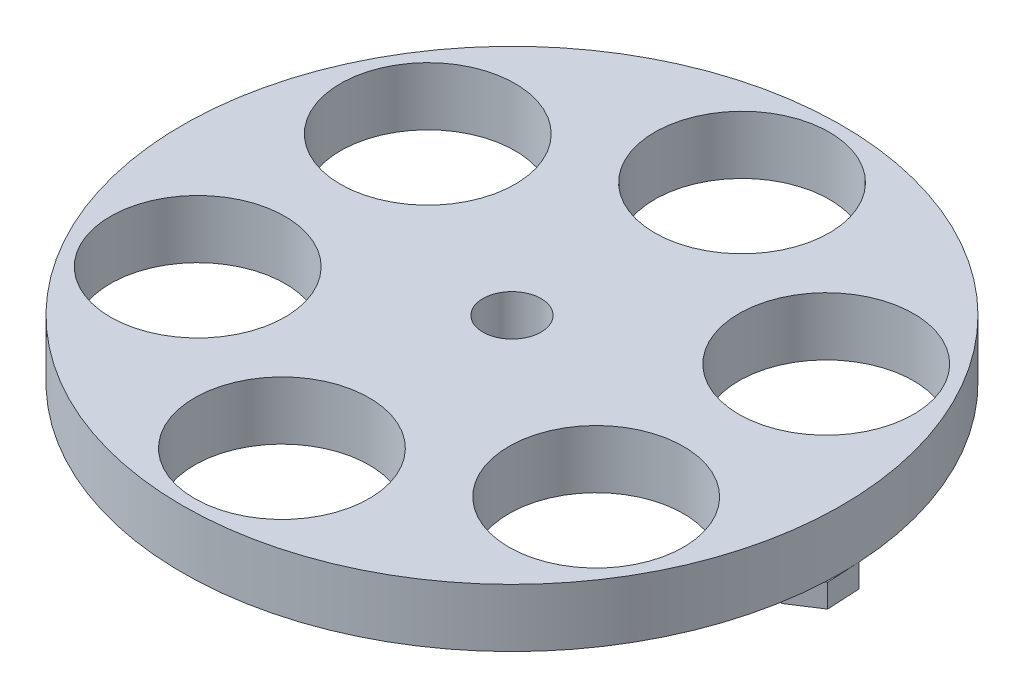
ISO-10303-21;
HEADER;
FILE_DESCRIPTION(('STEP AP214'),'2;1');
FILE_NAME('part.step','',(''),(''),'','','');
FILE_SCHEMA(('AUTOMOTIVE_DESIGN { 1 0 10303 214 1 1 1 1 }'));
ENDSEC;
DATA;
#1=APPLICATION_CONTEXT('core data for automotive mechanical design processes');
#2=APPLICATION_PROTOCOL_DEFINITION('international standard','automotive_design',2000,#1);
#3=PRODUCT_CONTEXT('',#1,'mechanical');
#4=PRODUCT('Part','Part','',(#3));
#5=PRODUCT_RELATED_PRODUCT_CATEGORY('part','',(#4));
#6=PRODUCT_DEFINITION_FORMATION('','',#4);
#7=PRODUCT_DEFINITION_CONTEXT('part definition',#1,'design');
#8=PRODUCT_DEFINITION('design','',#6,#7);
#9=PRODUCT_DEFINITION_SHAPE('','',#8);
#10=(LENGTH_UNIT() NAMED_UNIT(*) SI_UNIT(.MILLI.,.METRE.));
#11=(NAMED_UNIT(*) PLANE_ANGLE_UNIT() SI_UNIT($,.RADIAN.));
#12=(NAMED_UNIT(*) SI_UNIT($,.STERADIAN.) SOLID_ANGLE_UNIT());
#13=UNCERTAINTY_MEASURE_WITH_UNIT(LENGTH_MEASURE(1.E-05),#10,'distance_accuracy_value','');
#14=(GEOMETRIC_REPRESENTATION_CONTEXT(3) GLOBAL_UNCERTAINTY_ASSIGNED_CONTEXT((#13)) GLOBAL_UNIT_ASSIGNED_CONTEXT((#10,
#11,#12)) REPRESENTATION_CONTEXT('',''));
#15=CARTESIAN_POINT('',(0.,0.,0.));
#16=DIRECTION('',(0.,0.,1.));
#17=DIRECTION('',(1.,0.,0.));
#18=AXIS2_PLACEMENT_3D('',#15,#16,#17);
#19=CARTESIAN_POINT('',(0.,0.,0.));
#20=DIRECTION('',(0.,1.,0.));
#21=DIRECTION('',(0.,0.,1.));
#22=AXIS2_PLACEMENT_3D('',#19,#20,#21);
#23=PLANE('',#22);
#24=CARTESIAN_POINT('',(-68.4595093108157,0.,-39.5251161291902));
#25=DIRECTION('',(0.,1.,0.));
#26=DIRECTION('',(0.,0.,1.));
#27=AXIS2_PLACEMENT_3D('',#24,#25,#26);
#28=CIRCLE('',#27,30.);
#29=CARTESIAN_POINT('',(-68.4595093108157,0.,-9.52511612919019));
#30=VERTEX_POINT('',#29);
#31=EDGE_CURVE('E133',#30,#30,#28,.T.);
#32=ORIENTED_EDGE('',*,*,#31,.T.);
#33=EDGE_LOOP('',(#32));
#34=FACE_BOUND('',#33,.T.);
#35=CARTESIAN_POINT('',(-68.4595093108165,0.,39.5251161291887));
#36=DIRECTION('',(0.,1.,0.));
#37=DIRECTION('',(0.,0.,1.));
#38=AXIS2_PLACEMENT_3D('',#35,#36,#37);
#39=CIRCLE('',#38,30.);
#40=CARTESIAN_POINT('',(-68.4595093108165,0.,69.5251161291887));
#41=VERTEX_POINT('',#40);
#42=EDGE_CURVE('E405',#41,#41,#39,.T.);
#43=ORIENTED_EDGE('',*,*,#42,.T.);
#44=EDGE_LOOP('',(#43));
#45=FACE_BOUND('',#44,.T.);
#46=CARTESIAN_POINT('',(-5.5200482152269E-13,0.,79.0502322583788));
#47=DIRECTION('',(0.,1.,0.));
#48=DIRECTION('',(0.,0.,1.));
#49=AXIS2_PLACEMENT_3D('',#46,#47,#48);
#50=CIRCLE('',#49,30.);
#51=CARTESIAN_POINT('',(-5.5200482152269E-13,0.,109.050232258379));
#52=VERTEX_POINT('',#51);
#53=EDGE_CURVE('E415',#52,#52,#50,.T.);
#54=ORIENTED_EDGE('',*,*,#53,.T.);
#55=EDGE_LOOP('',(#54));
#56=FACE_BOUND('',#55,.T.);
#57=CARTESIAN_POINT('',(68.459509310816,0.,39.5251161291897));
#58=DIRECTION('',(0.,1.,0.));
#59=DIRECTION('',(0.,0.,1.));
#60=AXIS2_PLACEMENT_3D('',#57,#58,#59);
#61=CIRCLE('',#60,30.);
#62=CARTESIAN_POINT('',(68.459509310816,0.,69.5251161291897));
#63=VERTEX_POINT('',#62);
#64=EDGE_CURVE('E419',#63,#63,#61,.T.);
#65=ORIENTED_EDGE('',*,*,#64,.T.);
#66=EDGE_LOOP('',(#65));
#67=FACE_BOUND('',#66,.T.);
#68=CARTESIAN_POINT('',(68.4595093108162,0.,-39.5251161291892));
#69=DIRECTION('',(0.,1.,0.));
#70=DIRECTION('',(0.,0.,1.));
#71=AXIS2_PLACEMENT_3D('',#68,#69,#70);
#72=CIRCLE('',#71,30.);
#73=CARTESIAN_POINT('',(68.4595093108162,0.,-9.52511612918922));
#74=VERTEX_POINT('',#73);
#75=EDGE_CURVE('E427',#74,#74,#72,.T.);
#76=ORIENTED_EDGE('',*,*,#75,.T.);
#77=EDGE_LOOP('',(#76));
#78=FACE_BOUND('',#77,.T.);
#79=CARTESIAN_POINT('',(0.,0.,0.));
#80=DIRECTION('',(0.,1.,0.));
#81=DIRECTION('',(0.,0.,1.));
#82=AXIS2_PLACEMENT_3D('',#79,#80,#81);
#83=CIRCLE('',#82,10.);
#84=CARTESIAN_POINT('',(0.,0.,10.));
#85=VERTEX_POINT('',#84);
#86=EDGE_CURVE('E283',#85,#85,#83,.T.);
#87=ORIENTED_EDGE('',*,*,#86,.T.);
#88=EDGE_LOOP('',(#87));
#89=FACE_BOUND('',#88,.T.);
#90=CARTESIAN_POINT('',(0.,0.,-79.0502322583788));
#91=DIRECTION('',(0.,1.,0.));
#92=DIRECTION('',(0.,0.,1.));
#93=AXIS2_PLACEMENT_3D('',#90,#91,#92);
#94=CIRCLE('',#93,30.);
#95=CARTESIAN_POINT('',(0.,0.,-49.0502322583788));
#96=VERTEX_POINT('',#95);
#97=EDGE_CURVE('E275',#96,#96,#94,.T.);
#98=ORIENTED_EDGE('',*,*,#97,.T.);
#99=EDGE_LOOP('',(#98));
#100=FACE_BOUND('',#99,.T.);
#101=DIRECTION('',(-0.838864437276425,0.,0.544340386038835));
#102=VECTOR('',#101,1.);
#103=CARTESIAN_POINT('',(113.651716101007,0.,5.19766672348683));
#104=LINE('',#103,#102);
#105=CARTESIAN_POINT('',(113.091770209168,0.,5.56101644887739));
#106=VERTEX_POINT('',#105);
#107=CARTESIAN_POINT('',(104.054393451037,0.,11.4253837228936));
#108=VERTEX_POINT('',#107);
#109=EDGE_CURVE('E11',#106,#108,#104,.T.);
#110=ORIENTED_EDGE('',*,*,#109,.F.);
#111=CARTESIAN_POINT('',(0.,0.,0.));
#112=DIRECTION('',(0.,1.,0.));
#113=DIRECTION('',(0.,0.,1.));
#114=AXIS2_PLACEMENT_3D('',#111,#112,#113);
#115=CIRCLE('',#114,113.228412481091);
#116=CARTESIAN_POINT('',(113.057016296927,0.,-6.22771699939129));
#117=VERTEX_POINT('',#116);
#118=EDGE_CURVE('E186',#117,#106,#115,.T.);
#119=ORIENTED_EDGE('',*,*,#118,.F.);
#120=DIRECTION('',(0.89084482125367,0.,0.454307719993306));
#121=VECTOR('',#120,1.);
#122=CARTESIAN_POINT('',(102.864993842874,0.,-11.4253837228936));
#123=LINE('',#122,#121);
#124=CARTESIAN_POINT('',(102.864993842874,0.,-11.4253837228936));
#125=VERTEX_POINT('',#124);
#126=EDGE_CURVE('E66',#125,#117,#123,.T.);
#127=ORIENTED_EDGE('',*,*,#126,.F.);
#128=DIRECTION('',(0.838864437276425,0.,-0.544340386038833));
#129=VECTOR('',#128,1.);
#130=CARTESIAN_POINT('',(93.2676711929036,0.,-5.19766672348685));
#131=LINE('',#130,#129);
#132=CARTESIAN_POINT('',(93.2676711929036,0.,-5.19766672348685));
#133=VERTEX_POINT('',#132);
#134=EDGE_CURVE('E129',#133,#125,#131,.T.);
#135=ORIENTED_EDGE('',*,*,#134,.F.);
#136=DIRECTION('',(-0.0519803839772457,0.,-0.998648106032139));
#137=VECTOR('',#136,1.);
#138=CARTESIAN_POINT('',(93.8623709969848,0.,6.22771699940675));
#139=LINE('',#138,#137);
#140=CARTESIAN_POINT('',(93.8623709969848,0.,6.22771699940675));
#141=VERTEX_POINT('',#140);
#142=EDGE_CURVE('E164',#141,#133,#139,.T.);
#143=ORIENTED_EDGE('',*,*,#142,.F.);
#144=DIRECTION('',(-0.890844821253671,0.,-0.454307719993304));
#145=VECTOR('',#144,1.);
#146=CARTESIAN_POINT('',(104.054393451037,0.,11.4253837228936));
#147=LINE('',#146,#145);
#148=EDGE_CURVE('E160',#108,#141,#147,.T.);
#149=ORIENTED_EDGE('',*,*,#148,.F.);
#150=EDGE_LOOP('',(#110,#119,#127,#135,#143,#149));
#151=FACE_BOUND('',#150,.T.);
#152=ADVANCED_FACE('F45',(#34,#45,#56,#67,#78,#89,#100,#151),#23,.F.);
#153=CARTESIAN_POINT('',(0.,20.,0.));
#154=DIRECTION('',(0.,1.,0.));
#155=DIRECTION('',(0.,0.,1.));
#156=AXIS2_PLACEMENT_3D('',#153,#154,#155);
#157=PLANE('',#156);
#158=CARTESIAN_POINT('',(-68.4595093108165,20.,39.5251161291887));
#159=DIRECTION('',(0.,1.,0.));
#160=DIRECTION('',(0.,0.,1.));
#161=AXIS2_PLACEMENT_3D('',#158,#159,#160);
#162=CIRCLE('',#161,30.);
#163=CARTESIAN_POINT('',(-68.4595093108165,20.,69.5251161291887));
#164=VERTEX_POINT('',#163);
#165=EDGE_CURVE('E409',#164,#164,#162,.T.);
#166=ORIENTED_EDGE('',*,*,#165,.F.);
#167=EDGE_LOOP('',(#166));
#168=FACE_BOUND('',#167,.T.);
#169=CARTESIAN_POINT('',(68.459509310816,20.,39.5251161291897));
#170=DIRECTION('',(0.,1.,0.));
#171=DIRECTION('',(0.,0.,1.));
#172=AXIS2_PLACEMENT_3D('',#169,#170,#171);
#173=CIRCLE('',#172,30.);
#174=CARTESIAN_POINT('',(68.459509310816,20.,69.5251161291897));
#175=VERTEX_POINT('',#174);
#176=EDGE_CURVE('E423',#175,#175,#173,.T.);
#177=ORIENTED_EDGE('',*,*,#176,.F.);
#178=EDGE_LOOP('',(#177));
#179=FACE_BOUND('',#178,.T.);
#180=CARTESIAN_POINT('',(0.,20.,0.));
#181=DIRECTION('',(0.,1.,0.));
#182=DIRECTION('',(0.,0.,1.));
#183=AXIS2_PLACEMENT_3D('',#180,#181,#182);
#184=CIRCLE('',#183,10.);
#185=CARTESIAN_POINT('',(0.,20.,10.));
#186=VERTEX_POINT('',#185);
#187=EDGE_CURVE('E280',#186,#186,#184,.T.);
#188=ORIENTED_EDGE('',*,*,#187,.F.);
#189=EDGE_LOOP('',(#188));
#190=FACE_BOUND('',#189,.T.);
#191=CARTESIAN_POINT('',(0.,20.,0.));
#192=DIRECTION('',(0.,1.,0.));
#193=DIRECTION('',(0.,0.,1.));
#194=AXIS2_PLACEMENT_3D('',#191,#192,#193);
#195=CIRCLE('',#194,113.228412481091);
#196=CARTESIAN_POINT('',(0.,20.,113.228412481091));
#197=VERTEX_POINT('',#196);
#198=EDGE_CURVE('E57',#197,#197,#195,.T.);
#199=ORIENTED_EDGE('',*,*,#198,.T.);
#200=EDGE_LOOP('',(#199));
#201=FACE_BOUND('',#200,.T.);
#202=CARTESIAN_POINT('',(0.,20.,-79.0502322583788));
#203=DIRECTION('',(0.,1.,0.));
#204=DIRECTION('',(0.,0.,1.));
#205=AXIS2_PLACEMENT_3D('',#202,#203,#204);
#206=CIRCLE('',#205,30.);
#207=CARTESIAN_POINT('',(0.,20.,-49.0502322583788));
#208=VERTEX_POINT('',#207);
#209=EDGE_CURVE('E272',#208,#208,#206,.T.);
#210=ORIENTED_EDGE('',*,*,#209,.F.);
#211=EDGE_LOOP('',(#210));
#212=FACE_BOUND('',#211,.T.);
#213=CARTESIAN_POINT('',(68.4595093108162,20.,-39.5251161291892));
#214=DIRECTION('',(0.,1.,0.));
#215=DIRECTION('',(0.,0.,1.));
#216=AXIS2_PLACEMENT_3D('',#213,#214,#215);
#217=CIRCLE('',#216,30.);
#218=CARTESIAN_POINT('',(68.4595093108162,20.,-9.52511612918922));
#219=VERTEX_POINT('',#218);
#220=EDGE_CURVE('E397',#219,#219,#217,.T.);
#221=ORIENTED_EDGE('',*,*,#220,.F.);
#222=EDGE_LOOP('',(#221));
#223=FACE_BOUND('',#222,.T.);
#224=CARTESIAN_POINT('',(-5.5200482152269E-13,20.,79.0502322583788));
#225=DIRECTION('',(0.,1.,0.));
#226=DIRECTION('',(0.,0.,1.));
#227=AXIS2_PLACEMENT_3D('',#224,#225,#226);
#228=CIRCLE('',#227,30.);
#229=CARTESIAN_POINT('',(-5.5200482152269E-13,20.,109.050232258379));
#230=VERTEX_POINT('',#229);
#231=EDGE_CURVE('E401',#230,#230,#228,.T.);
#232=ORIENTED_EDGE('',*,*,#231,.F.);
#233=EDGE_LOOP('',(#232));
#234=FACE_BOUND('',#233,.T.);
#235=CARTESIAN_POINT('',(-68.4595093108157,20.,-39.5251161291902));
#236=DIRECTION('',(0.,1.,0.));
#237=DIRECTION('',(0.,0.,1.));
#238=AXIS2_PLACEMENT_3D('',#235,#236,#237);
#239=CIRCLE('',#238,30.);
#240=CARTESIAN_POINT('',(-68.4595093108157,20.,-9.52511612919019));
#241=VERTEX_POINT('',#240);
#242=EDGE_CURVE('E138',#241,#241,#239,.T.);
#243=ORIENTED_EDGE('',*,*,#242,.F.);
#244=EDGE_LOOP('',(#243));
#245=FACE_BOUND('',#244,.T.);
#246=ADVANCED_FACE('F211',(#168,#179,#190,#201,#212,#223,#234,#245),#157,.T.);
#247=CARTESIAN_POINT('',(0.,20.,0.));
#248=DIRECTION('',(0.,-1.,0.));
#249=DIRECTION('',(0.,0.,-1.));
#250=AXIS2_PLACEMENT_3D('',#247,#248,#249);
#251=CYLINDRICAL_SURFACE('',#250,113.228412481091);
#252=ORIENTED_EDGE('',*,*,#198,.F.);
#253=EDGE_LOOP('',(#252));
#254=FACE_BOUND('',#253,.T.);
#255=CARTESIAN_POINT('',(113.092628127426,0.,-5.54354184793427));
#256=VERTEX_POINT('',#255);
#257=EDGE_CURVE('E189',#106,#256,#115,.T.);
#258=ORIENTED_EDGE('',*,*,#257,.T.);
#259=CARTESIAN_POINT('',(113.057016296926,0.,-6.22771699940676));
#260=DIRECTION('',(0.0519803839772377,0.,0.998648106032139));
#261=VECTOR('',#260,1.);
#262=LINE('',#259,#261);
#263=EDGE_CURVE('E161',#117,#256,#262,.T.);
#264=ORIENTED_EDGE('',*,*,#263,.F.);
#265=ORIENTED_EDGE('',*,*,#118,.T.);
#266=EDGE_LOOP('',(#258,#264,#265));
#267=FACE_BOUND('',#266,.T.);
#268=ADVANCED_FACE('F47',(#254,#267),#251,.T.);
#269=CARTESIAN_POINT('',(0.,20.,-79.0502322583788));
#270=DIRECTION('',(0.,-1.,0.));
#271=DIRECTION('',(0.,0.,-1.));
#272=AXIS2_PLACEMENT_3D('',#269,#270,#271);
#273=CYLINDRICAL_SURFACE('',#272,30.);
#274=ORIENTED_EDGE('',*,*,#209,.T.);
#275=EDGE_LOOP('',(#274));
#276=FACE_BOUND('',#275,.T.);
#277=ORIENTED_EDGE('',*,*,#97,.F.);
#278=EDGE_LOOP('',(#277));
#279=FACE_BOUND('',#278,.T.);
#280=ADVANCED_FACE('F222',(#276,#279),#273,.F.);
#281=CARTESIAN_POINT('',(0.,20.,0.));
#282=DIRECTION('',(0.,-1.,0.));
#283=DIRECTION('',(0.,0.,-1.));
#284=AXIS2_PLACEMENT_3D('',#281,#282,#283);
#285=CYLINDRICAL_SURFACE('',#284,10.);
#286=ORIENTED_EDGE('',*,*,#187,.T.);
#287=EDGE_LOOP('',(#286));
#288=FACE_BOUND('',#287,.T.);
#289=ORIENTED_EDGE('',*,*,#86,.F.);
#290=EDGE_LOOP('',(#289));
#291=FACE_BOUND('',#290,.T.);
#292=ADVANCED_FACE('F225',(#288,#291),#285,.F.);
#293=CARTESIAN_POINT('',(68.4595093108162,20.,-39.5251161291892));
#294=DIRECTION('',(0.,-1.,0.));
#295=DIRECTION('',(0.,0.,-1.));
#296=AXIS2_PLACEMENT_3D('',#293,#294,#295);
#297=CYLINDRICAL_SURFACE('',#296,30.);
#298=ORIENTED_EDGE('',*,*,#220,.T.);
#299=EDGE_LOOP('',(#298));
#300=FACE_BOUND('',#299,.T.);
#301=ORIENTED_EDGE('',*,*,#75,.F.);
#302=EDGE_LOOP('',(#301));
#303=FACE_BOUND('',#302,.T.);
#304=ADVANCED_FACE('F229',(#300,#303),#297,.F.);
#305=CARTESIAN_POINT('',(68.459509310816,20.,39.5251161291897));
#306=DIRECTION('',(0.,-1.,0.));
#307=DIRECTION('',(0.,0.,-1.));
#308=AXIS2_PLACEMENT_3D('',#305,#306,#307);
#309=CYLINDRICAL_SURFACE('',#308,30.);
#310=ORIENTED_EDGE('',*,*,#176,.T.);
#311=EDGE_LOOP('',(#310));
#312=FACE_BOUND('',#311,.T.);
#313=ORIENTED_EDGE('',*,*,#64,.F.);
#314=EDGE_LOOP('',(#313));
#315=FACE_BOUND('',#314,.T.);
#316=ADVANCED_FACE('F233',(#312,#315),#309,.F.);
#317=CARTESIAN_POINT('',(-5.5200482152269E-13,20.,79.0502322583788));
#318=DIRECTION('',(0.,-1.,0.));
#319=DIRECTION('',(0.,0.,-1.));
#320=AXIS2_PLACEMENT_3D('',#317,#318,#319);
#321=CYLINDRICAL_SURFACE('',#320,30.);
#322=ORIENTED_EDGE('',*,*,#231,.T.);
#323=EDGE_LOOP('',(#322));
#324=FACE_BOUND('',#323,.T.);
#325=ORIENTED_EDGE('',*,*,#53,.F.);
#326=EDGE_LOOP('',(#325));
#327=FACE_BOUND('',#326,.T.);
#328=ADVANCED_FACE('F237',(#324,#327),#321,.F.);
#329=CARTESIAN_POINT('',(-68.4595093108165,20.,39.5251161291887));
#330=DIRECTION('',(0.,-1.,0.));
#331=DIRECTION('',(0.,0.,-1.));
#332=AXIS2_PLACEMENT_3D('',#329,#330,#331);
#333=CYLINDRICAL_SURFACE('',#332,30.);
#334=ORIENTED_EDGE('',*,*,#165,.T.);
#335=EDGE_LOOP('',(#334));
#336=FACE_BOUND('',#335,.T.);
#337=ORIENTED_EDGE('',*,*,#42,.F.);
#338=EDGE_LOOP('',(#337));
#339=FACE_BOUND('',#338,.T.);
#340=ADVANCED_FACE('F241',(#336,#339),#333,.F.);
#341=CARTESIAN_POINT('',(-68.4595093108157,20.,-39.5251161291902));
#342=DIRECTION('',(0.,-1.,0.));
#343=DIRECTION('',(0.,0.,-1.));
#344=AXIS2_PLACEMENT_3D('',#341,#342,#343);
#345=CYLINDRICAL_SURFACE('',#344,30.);
#346=ORIENTED_EDGE('',*,*,#242,.T.);
#347=EDGE_LOOP('',(#346));
#348=FACE_BOUND('',#347,.T.);
#349=ORIENTED_EDGE('',*,*,#31,.F.);
#350=EDGE_LOOP('',(#349));
#351=FACE_BOUND('',#350,.T.);
#352=ADVANCED_FACE('F245',(#348,#351),#345,.F.);
#353=CARTESIAN_POINT('',(102.864993842874,-8.,-11.4253837228936));
#354=DIRECTION('',(-0.454307719993307,0.,0.89084482125367));
#355=DIRECTION('',(0.89084482125367,0.,0.454307719993306));
#356=AXIS2_PLACEMENT_3D('',#353,#354,#355);
#357=PLANE('',#356);
#358=ORIENTED_EDGE('',*,*,#126,.T.);
#359=DIRECTION('',(0.,1.,0.));
#360=VECTOR('',#359,1.);
#361=CARTESIAN_POINT('',(113.057016296926,-8.,-6.22771699940676));
#362=LINE('',#361,#360);
#363=CARTESIAN_POINT('',(113.057016296926,-8.,-6.22771699940676));
#364=VERTEX_POINT('',#363);
#365=EDGE_CURVE('E113',#364,#117,#362,.T.);
#366=ORIENTED_EDGE('',*,*,#365,.F.);
#367=DIRECTION('',(0.89084482125367,0.,0.454307719993306));
#368=VECTOR('',#367,1.);
#369=CARTESIAN_POINT('',(102.864993842874,-8.,-11.4253837228936));
#370=LINE('',#369,#368);
#371=CARTESIAN_POINT('',(102.864993842874,-8.,-11.4253837228936));
#372=VERTEX_POINT('',#371);
#373=EDGE_CURVE('E121',#372,#364,#370,.T.);
#374=ORIENTED_EDGE('',*,*,#373,.F.);
#375=DIRECTION('',(0.,1.,0.));
#376=VECTOR('',#375,1.);
#377=CARTESIAN_POINT('',(102.864993842874,-8.,-11.4253837228936));
#378=LINE('',#377,#376);
#379=EDGE_CURVE('E169',#372,#125,#378,.T.);
#380=ORIENTED_EDGE('',*,*,#379,.T.);
#381=EDGE_LOOP('',(#358,#366,#374,#380));
#382=FACE_BOUND('',#381,.T.);
#383=ADVANCED_FACE('F131',(#382),#357,.F.);
#384=CARTESIAN_POINT('',(113.057016296926,-8.,-6.22771699940676));
#385=DIRECTION('',(-0.998648106032139,0.,0.051980383977247));
#386=DIRECTION('',(0.051980383977247,0.,0.998648106032139));
#387=AXIS2_PLACEMENT_3D('',#384,#385,#386);
#388=PLANE('',#387);
#389=ORIENTED_EDGE('',*,*,#263,.T.);
#390=DIRECTION('',(0.051980383977247,0.,0.998648106032139));
#391=VECTOR('',#390,1.);
#392=CARTESIAN_POINT('',(113.057016296926,0.,-6.22771699940676));
#393=LINE('',#392,#391);
#394=CARTESIAN_POINT('',(113.651716101007,0.,5.19766672348683));
#395=VERTEX_POINT('',#394);
#396=EDGE_CURVE('E74',#256,#395,#393,.T.);
#397=ORIENTED_EDGE('',*,*,#396,.T.);
#398=DIRECTION('',(0.,1.,0.));
#399=VECTOR('',#398,1.);
#400=CARTESIAN_POINT('',(113.651716101007,-8.,5.19766672348683));
#401=LINE('',#400,#399);
#402=CARTESIAN_POINT('',(113.651716101007,-8.,5.19766672348683));
#403=VERTEX_POINT('',#402);
#404=EDGE_CURVE('E116',#403,#395,#401,.T.);
#405=ORIENTED_EDGE('',*,*,#404,.F.);
#406=DIRECTION('',(0.051980383977247,0.,0.998648106032139));
#407=VECTOR('',#406,1.);
#408=CARTESIAN_POINT('',(113.057016296926,-8.,-6.22771699940676));
#409=LINE('',#408,#407);
#410=EDGE_CURVE('E110',#364,#403,#409,.T.);
#411=ORIENTED_EDGE('',*,*,#410,.F.);
#412=ORIENTED_EDGE('',*,*,#365,.T.);
#413=EDGE_LOOP('',(#389,#397,#405,#411,#412));
#414=FACE_BOUND('',#413,.T.);
#415=ADVANCED_FACE('F112',(#414),#388,.F.);
#416=CARTESIAN_POINT('',(113.651716101007,-8.,5.19766672348683));
#417=DIRECTION('',(-0.544340386038835,0.,-0.838864437276425));
#418=DIRECTION('',(-0.838864437276425,0.,0.544340386038835));
#419=AXIS2_PLACEMENT_3D('',#416,#417,#418);
#420=PLANE('',#419);
#421=EDGE_CURVE('E59',#395,#106,#104,.T.);
#422=ORIENTED_EDGE('',*,*,#421,.T.);
#423=ORIENTED_EDGE('',*,*,#109,.T.);
#424=DIRECTION('',(0.,1.,0.));
#425=VECTOR('',#424,1.);
#426=CARTESIAN_POINT('',(104.054393451037,-8.,11.4253837228936));
#427=LINE('',#426,#425);
#428=CARTESIAN_POINT('',(104.054393451037,-8.,11.4253837228936));
#429=VERTEX_POINT('',#428);
#430=EDGE_CURVE('E140',#429,#108,#427,.T.);
#431=ORIENTED_EDGE('',*,*,#430,.F.);
#432=DIRECTION('',(-0.838864437276425,0.,0.544340386038835));
#433=VECTOR('',#432,1.);
#434=CARTESIAN_POINT('',(113.651716101007,-8.,5.19766672348683));
#435=LINE('',#434,#433);
#436=EDGE_CURVE('E120',#403,#429,#435,.T.);
#437=ORIENTED_EDGE('',*,*,#436,.F.);
#438=ORIENTED_EDGE('',*,*,#404,.T.);
#439=EDGE_LOOP('',(#422,#423,#431,#437,#438));
#440=FACE_BOUND('',#439,.T.);
#441=ADVANCED_FACE('F198',(#440),#420,.F.);
#442=CARTESIAN_POINT('',(104.054393451037,-8.,11.4253837228936));
#443=DIRECTION('',(0.454307719993304,0.,-0.890844821253671));
#444=DIRECTION('',(-0.890844821253671,0.,-0.454307719993304));
#445=AXIS2_PLACEMENT_3D('',#442,#443,#444);
#446=PLANE('',#445);
#447=ORIENTED_EDGE('',*,*,#148,.T.);
#448=DIRECTION('',(0.,1.,0.));
#449=VECTOR('',#448,1.);
#450=CARTESIAN_POINT('',(93.8623709969848,-8.,6.22771699940675));
#451=LINE('',#450,#449);
#452=CARTESIAN_POINT('',(93.8623709969848,-8.,6.22771699940675));
#453=VERTEX_POINT('',#452);
#454=EDGE_CURVE('E176',#453,#141,#451,.T.);
#455=ORIENTED_EDGE('',*,*,#454,.F.);
#456=DIRECTION('',(-0.890844821253671,0.,-0.454307719993304));
#457=VECTOR('',#456,1.);
#458=CARTESIAN_POINT('',(104.054393451037,-8.,11.4253837228936));
#459=LINE('',#458,#457);
#460=EDGE_CURVE('E465',#429,#453,#459,.T.);
#461=ORIENTED_EDGE('',*,*,#460,.F.);
#462=ORIENTED_EDGE('',*,*,#430,.T.);
#463=EDGE_LOOP('',(#447,#455,#461,#462));
#464=FACE_BOUND('',#463,.T.);
#465=ADVANCED_FACE('F255',(#464),#446,.F.);
#466=CARTESIAN_POINT('',(93.8623709969848,-8.,6.22771699940675));
#467=DIRECTION('',(0.998648106032139,0.,-0.0519803839772457));
#468=DIRECTION('',(-0.0519803839772457,0.,-0.998648106032139));
#469=AXIS2_PLACEMENT_3D('',#466,#467,#468);
#470=PLANE('',#469);
#471=ORIENTED_EDGE('',*,*,#142,.T.);
#472=DIRECTION('',(0.,1.,0.));
#473=VECTOR('',#472,1.);
#474=CARTESIAN_POINT('',(93.2676711929036,-8.,-5.19766672348685));
#475=LINE('',#474,#473);
#476=CARTESIAN_POINT('',(93.2676711929036,-8.,-5.19766672348685));
#477=VERTEX_POINT('',#476);
#478=EDGE_CURVE('E172',#477,#133,#475,.T.);
#479=ORIENTED_EDGE('',*,*,#478,.F.);
#480=DIRECTION('',(-0.0519803839772457,0.,-0.998648106032139));
#481=VECTOR('',#480,1.);
#482=CARTESIAN_POINT('',(93.8623709969848,-8.,6.22771699940675));
#483=LINE('',#482,#481);
#484=EDGE_CURVE('E468',#453,#477,#483,.T.);
#485=ORIENTED_EDGE('',*,*,#484,.F.);
#486=ORIENTED_EDGE('',*,*,#454,.T.);
#487=EDGE_LOOP('',(#471,#479,#485,#486));
#488=FACE_BOUND('',#487,.T.);
#489=ADVANCED_FACE('F258',(#488),#470,.F.);
#490=CARTESIAN_POINT('',(93.2676711929036,-8.,-5.19766672348685));
#491=DIRECTION('',(0.544340386038833,0.,0.838864437276426));
#492=DIRECTION('',(0.838864437276426,0.,-0.544340386038833));
#493=AXIS2_PLACEMENT_3D('',#490,#491,#492);
#494=PLANE('',#493);
#495=ORIENTED_EDGE('',*,*,#134,.T.);
#496=ORIENTED_EDGE('',*,*,#379,.F.);
#497=DIRECTION('',(0.838864437276425,0.,-0.544340386038833));
#498=VECTOR('',#497,1.);
#499=CARTESIAN_POINT('',(93.2676711929036,-8.,-5.19766672348685));
#500=LINE('',#499,#498);
#501=EDGE_CURVE('E126',#477,#372,#500,.T.);
#502=ORIENTED_EDGE('',*,*,#501,.F.);
#503=ORIENTED_EDGE('',*,*,#478,.T.);
#504=EDGE_LOOP('',(#495,#496,#502,#503));
#505=FACE_BOUND('',#504,.T.);
#506=ADVANCED_FACE('F207',(#505),#494,.F.);
#507=CARTESIAN_POINT('',(0.,-8.,0.));
#508=DIRECTION('',(0.,-1.,0.));
#509=DIRECTION('',(0.,0.,-1.));
#510=AXIS2_PLACEMENT_3D('',#507,#508,#509);
#511=PLANE('',#510);
#512=ORIENTED_EDGE('',*,*,#373,.T.);
#513=ORIENTED_EDGE('',*,*,#410,.T.);
#514=ORIENTED_EDGE('',*,*,#436,.T.);
#515=ORIENTED_EDGE('',*,*,#460,.T.);
#516=ORIENTED_EDGE('',*,*,#484,.T.);
#517=ORIENTED_EDGE('',*,*,#501,.T.);
#518=EDGE_LOOP('',(#512,#513,#514,#515,#516,#517));
#519=FACE_BOUND('',#518,.T.);
#520=ADVANCED_FACE('F124',(#519),#511,.T.);
#521=CARTESIAN_POINT('',(0.,0.,0.));
#522=DIRECTION('',(0.,-1.,0.));
#523=DIRECTION('',(0.,0.,-1.));
#524=AXIS2_PLACEMENT_3D('',#521,#522,#523);
#525=PLANE('',#524);
#526=ORIENTED_EDGE('',*,*,#257,.F.);
#527=ORIENTED_EDGE('',*,*,#421,.F.);
#528=ORIENTED_EDGE('',*,*,#396,.F.);
#529=EDGE_LOOP('',(#526,#527,#528));
#530=FACE_BOUND('',#529,.T.);
#531=ADVANCED_FACE('F201',(#530),#525,.F.);
#532=CLOSED_SHELL('',(#152,#246,#268,#280,#292,#304,#316,#328,#340,#352,#383,#415,#441,#465,
#489,#506,#520,#531));
#533=MANIFOLD_SOLID_BREP('B2',#532);
#534=ADVANCED_BREP_SHAPE_REPRESENTATION('',(#18,#533),#14);
#535=SHAPE_DEFINITION_REPRESENTATION(#9,#534);
ENDSEC;
END-ISO-10303-21;
